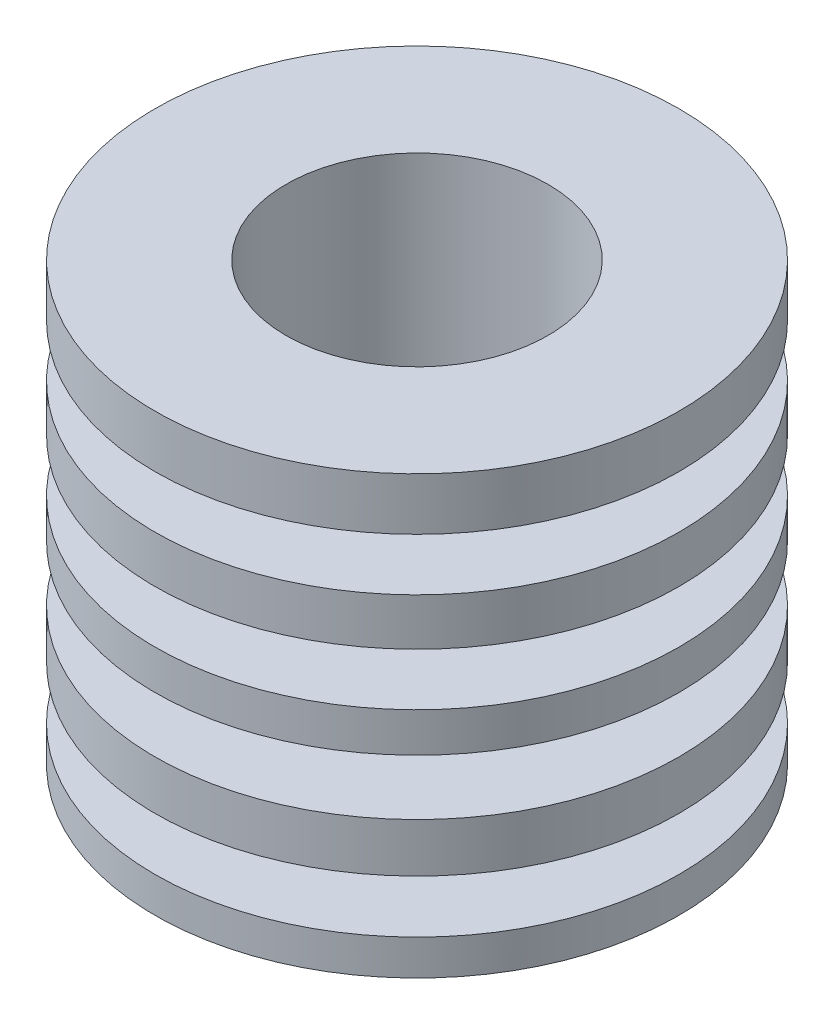
ISO-10303-21;
HEADER;
FILE_DESCRIPTION(('STEP AP214'),'2;1');
FILE_NAME('part.step','',(''),(''),'','','');
FILE_SCHEMA(('AUTOMOTIVE_DESIGN { 1 0 10303 214 1 1 1 1 }'));
ENDSEC;
DATA;
#1=APPLICATION_CONTEXT('core data for automotive mechanical design processes');
#2=APPLICATION_PROTOCOL_DEFINITION('international standard','automotive_design',2000,#1);
#3=PRODUCT_CONTEXT('',#1,'mechanical');
#4=PRODUCT('Part','Part','',(#3));
#5=PRODUCT_RELATED_PRODUCT_CATEGORY('part','',(#4));
#6=PRODUCT_DEFINITION_FORMATION('','',#4);
#7=PRODUCT_DEFINITION_CONTEXT('part definition',#1,'design');
#8=PRODUCT_DEFINITION('design','',#6,#7);
#9=PRODUCT_DEFINITION_SHAPE('','',#8);
#10=(LENGTH_UNIT() NAMED_UNIT(*) SI_UNIT(.MILLI.,.METRE.));
#11=(NAMED_UNIT(*) PLANE_ANGLE_UNIT() SI_UNIT($,.RADIAN.));
#12=(NAMED_UNIT(*) SI_UNIT($,.STERADIAN.) SOLID_ANGLE_UNIT());
#13=UNCERTAINTY_MEASURE_WITH_UNIT(LENGTH_MEASURE(1.E-05),#10,'distance_accuracy_value','');
#14=(GEOMETRIC_REPRESENTATION_CONTEXT(3) GLOBAL_UNCERTAINTY_ASSIGNED_CONTEXT((#13)) GLOBAL_UNIT_ASSIGNED_CONTEXT((#10,
#11,#12)) REPRESENTATION_CONTEXT('',''));
#15=CARTESIAN_POINT('',(0.,0.,0.));
#16=DIRECTION('',(0.,0.,1.));
#17=DIRECTION('',(1.,0.,0.));
#18=AXIS2_PLACEMENT_3D('',#15,#16,#17);
#19=CARTESIAN_POINT('',(0.,0.,0.));
#20=DIRECTION('',(0.,-1.,0.));
#21=DIRECTION('',(0.,0.,-1.));
#22=AXIS2_PLACEMENT_3D('',#19,#20,#21);
#23=CYLINDRICAL_SURFACE('',#22,150.);
#24=CARTESIAN_POINT('',(0.,190.,0.));
#25=DIRECTION('',(0.,-1.,0.));
#26=DIRECTION('',(1.,0.,0.));
#27=AXIS2_PLACEMENT_3D('',#24,#25,#26);
#28=CIRCLE('',#27,150.);
#29=CARTESIAN_POINT('',(150.,190.,0.));
#30=VERTEX_POINT('',#29);
#31=EDGE_CURVE('E50',#30,#30,#28,.T.);
#32=ORIENTED_EDGE('',*,*,#31,.T.);
#33=EDGE_LOOP('',(#32));
#34=FACE_BOUND('',#33,.T.);
#35=CARTESIAN_POINT('',(0.,163.026485548913,0.));
#36=DIRECTION('',(0.,-1.,0.));
#37=DIRECTION('',(1.,0.,0.));
#38=AXIS2_PLACEMENT_3D('',#35,#36,#37);
#39=CIRCLE('',#38,150.);
#40=CARTESIAN_POINT('',(150.,163.026485548913,0.));
#41=VERTEX_POINT('',#40);
#42=EDGE_CURVE('E79',#41,#41,#39,.T.);
#43=ORIENTED_EDGE('',*,*,#42,.F.);
#44=EDGE_LOOP('',(#43));
#45=FACE_BOUND('',#44,.T.);
#46=ADVANCED_FACE('F30',(#34,#45),#23,.T.);
#47=CARTESIAN_POINT('',(0.,0.,0.));
#48=DIRECTION('',(0.,-1.,0.));
#49=DIRECTION('',(0.,0.,-1.));
#50=AXIS2_PLACEMENT_3D('',#47,#48,#49);
#51=CIRCLE('',#50,150.);
#52=CARTESIAN_POINT('',(0.,0.,-150.));
#53=VERTEX_POINT('',#52);
#54=EDGE_CURVE('E41',#53,#53,#51,.T.);
#55=ORIENTED_EDGE('',*,*,#54,.F.);
#56=EDGE_LOOP('',(#55));
#57=FACE_BOUND('',#56,.T.);
#58=CARTESIAN_POINT('',(0.,20.2971054379458,0.));
#59=DIRECTION('',(0.,-1.,0.));
#60=DIRECTION('',(1.,0.,0.));
#61=AXIS2_PLACEMENT_3D('',#58,#59,#60);
#62=CIRCLE('',#61,150.);
#63=CARTESIAN_POINT('',(150.,20.2971054379458,0.));
#64=VERTEX_POINT('',#63);
#65=EDGE_CURVE('E63',#64,#64,#62,.T.);
#66=ORIENTED_EDGE('',*,*,#65,.T.);
#67=EDGE_LOOP('',(#66));
#68=FACE_BOUND('',#67,.T.);
#69=ADVANCED_FACE('F103',(#57,#68),#23,.T.);
#70=CARTESIAN_POINT('',(0.,250.,0.));
#71=DIRECTION('',(0.,-1.,0.));
#72=DIRECTION('',(0.,0.,-1.));
#73=AXIS2_PLACEMENT_3D('',#70,#71,#72);
#74=CIRCLE('',#73,150.);
#75=CARTESIAN_POINT('',(0.,250.,-150.));
#76=VERTEX_POINT('',#75);
#77=EDGE_CURVE('E37',#76,#76,#74,.T.);
#78=ORIENTED_EDGE('',*,*,#77,.T.);
#79=EDGE_LOOP('',(#78));
#80=FACE_BOUND('',#79,.T.);
#81=CARTESIAN_POINT('',(0.,220.,0.));
#82=DIRECTION('',(0.,-1.,0.));
#83=DIRECTION('',(1.,0.,0.));
#84=AXIS2_PLACEMENT_3D('',#81,#82,#83);
#85=CIRCLE('',#84,150.);
#86=CARTESIAN_POINT('',(150.,220.,0.));
#87=VERTEX_POINT('',#86);
#88=EDGE_CURVE('E59',#87,#87,#85,.T.);
#89=ORIENTED_EDGE('',*,*,#88,.F.);
#90=EDGE_LOOP('',(#89));
#91=FACE_BOUND('',#90,.T.);
#92=ADVANCED_FACE('F111',(#80,#91),#23,.T.);
#93=CARTESIAN_POINT('',(0.,0.,0.));
#94=DIRECTION('',(0.,-1.,0.));
#95=DIRECTION('',(0.,0.,-1.));
#96=AXIS2_PLACEMENT_3D('',#93,#94,#95);
#97=CYLINDRICAL_SURFACE('',#96,75.);
#98=CARTESIAN_POINT('',(0.,250.,0.));
#99=DIRECTION('',(0.,-1.,0.));
#100=DIRECTION('',(0.,0.,-1.));
#101=AXIS2_PLACEMENT_3D('',#98,#99,#100);
#102=CIRCLE('',#101,75.);
#103=CARTESIAN_POINT('',(0.,250.,-75.));
#104=VERTEX_POINT('',#103);
#105=EDGE_CURVE('E10',#104,#104,#102,.T.);
#106=ORIENTED_EDGE('',*,*,#105,.F.);
#107=EDGE_LOOP('',(#106));
#108=FACE_BOUND('',#107,.T.);
#109=CARTESIAN_POINT('',(0.,0.,0.));
#110=DIRECTION('',(0.,-1.,0.));
#111=DIRECTION('',(0.,0.,-1.));
#112=AXIS2_PLACEMENT_3D('',#109,#110,#111);
#113=CIRCLE('',#112,75.);
#114=CARTESIAN_POINT('',(0.,0.,-75.));
#115=VERTEX_POINT('',#114);
#116=EDGE_CURVE('E45',#115,#115,#113,.T.);
#117=ORIENTED_EDGE('',*,*,#116,.T.);
#118=EDGE_LOOP('',(#117));
#119=FACE_BOUND('',#118,.T.);
#120=ADVANCED_FACE('F32',(#108,#119),#97,.F.);
#121=CARTESIAN_POINT('',(-75.,250.,0.));
#122=DIRECTION('',(0.,-1.,0.));
#123=DIRECTION('',(0.,0.,-1.));
#124=AXIS2_PLACEMENT_3D('',#121,#122,#123);
#125=PLANE('',#124);
#126=ORIENTED_EDGE('',*,*,#77,.F.);
#127=EDGE_LOOP('',(#126));
#128=FACE_BOUND('',#127,.T.);
#129=ORIENTED_EDGE('',*,*,#105,.T.);
#130=EDGE_LOOP('',(#129));
#131=FACE_BOUND('',#130,.T.);
#132=ADVANCED_FACE('F131',(#128,#131),#125,.F.);
#133=CARTESIAN_POINT('',(-75.,0.,0.));
#134=DIRECTION('',(0.,1.,0.));
#135=DIRECTION('',(0.,0.,1.));
#136=AXIS2_PLACEMENT_3D('',#133,#134,#135);
#137=PLANE('',#136);
#138=ORIENTED_EDGE('',*,*,#116,.F.);
#139=EDGE_LOOP('',(#138));
#140=FACE_BOUND('',#139,.T.);
#141=ORIENTED_EDGE('',*,*,#54,.T.);
#142=EDGE_LOOP('',(#141));
#143=FACE_BOUND('',#142,.T.);
#144=ADVANCED_FACE('F152',(#140,#143),#137,.F.);
#145=CARTESIAN_POINT('',(-150.,190.,0.));
#146=DIRECTION('',(0.,1.,0.));
#147=DIRECTION('',(-1.,0.,0.));
#148=AXIS2_PLACEMENT_3D('',#145,#146,#147);
#149=PLANE('',#148);
#150=CARTESIAN_POINT('',(0.,190.,0.));
#151=DIRECTION('',(0.,-1.,0.));
#152=DIRECTION('',(1.,0.,0.));
#153=AXIS2_PLACEMENT_3D('',#150,#151,#152);
#154=CIRCLE('',#153,80.0301323284701);
#155=CARTESIAN_POINT('',(80.0301323284701,190.,0.));
#156=VERTEX_POINT('',#155);
#157=EDGE_CURVE('E53',#156,#156,#154,.T.);
#158=ORIENTED_EDGE('',*,*,#157,.T.);
#159=EDGE_LOOP('',(#158));
#160=FACE_BOUND('',#159,.T.);
#161=ORIENTED_EDGE('',*,*,#31,.F.);
#162=EDGE_LOOP('',(#161));
#163=FACE_BOUND('',#162,.T.);
#164=ADVANCED_FACE('F146',(#160,#163),#149,.T.);
#165=CARTESIAN_POINT('',(0.,0.,0.));
#166=DIRECTION('',(0.,-1.,0.));
#167=DIRECTION('',(1.,0.,0.));
#168=AXIS2_PLACEMENT_3D('',#165,#166,#167);
#169=CYLINDRICAL_SURFACE('',#168,80.0301323284701);
#170=CARTESIAN_POINT('',(0.,220.,0.));
#171=DIRECTION('',(0.,-1.,0.));
#172=DIRECTION('',(1.,0.,0.));
#173=AXIS2_PLACEMENT_3D('',#170,#171,#172);
#174=CIRCLE('',#173,80.0301323284701);
#175=CARTESIAN_POINT('',(80.03013232847,220.,0.));
#176=VERTEX_POINT('',#175);
#177=EDGE_CURVE('E56',#176,#176,#174,.T.);
#178=ORIENTED_EDGE('',*,*,#177,.T.);
#179=EDGE_LOOP('',(#178));
#180=FACE_BOUND('',#179,.T.);
#181=ORIENTED_EDGE('',*,*,#157,.F.);
#182=EDGE_LOOP('',(#181));
#183=FACE_BOUND('',#182,.T.);
#184=ADVANCED_FACE('F140',(#180,#183),#169,.T.);
#185=CARTESIAN_POINT('',(-150.,220.,0.));
#186=DIRECTION('',(0.,-1.,0.));
#187=DIRECTION('',(1.,0.,0.));
#188=AXIS2_PLACEMENT_3D('',#185,#186,#187);
#189=PLANE('',#188);
#190=ORIENTED_EDGE('',*,*,#88,.T.);
#191=EDGE_LOOP('',(#190));
#192=FACE_BOUND('',#191,.T.);
#193=ORIENTED_EDGE('',*,*,#177,.F.);
#194=EDGE_LOOP('',(#193));
#195=FACE_BOUND('',#194,.T.);
#196=ADVANCED_FACE('F136',(#192,#195),#189,.T.);
#197=CARTESIAN_POINT('',(-150.,20.2971054379457,0.));
#198=DIRECTION('',(0.,1.,0.));
#199=DIRECTION('',(-1.,0.,0.));
#200=AXIS2_PLACEMENT_3D('',#197,#198,#199);
#201=PLANE('',#200);
#202=CARTESIAN_POINT('',(0.,20.2971054379457,0.));
#203=DIRECTION('',(0.,-1.,0.));
#204=DIRECTION('',(1.,0.,0.));
#205=AXIS2_PLACEMENT_3D('',#202,#203,#204);
#206=CIRCLE('',#205,80.0301323284702);
#207=CARTESIAN_POINT('',(80.0301323284702,20.2971054379458,0.));
#208=VERTEX_POINT('',#207);
#209=EDGE_CURVE('E67',#208,#208,#206,.T.);
#210=ORIENTED_EDGE('',*,*,#209,.T.);
#211=EDGE_LOOP('',(#210));
#212=FACE_BOUND('',#211,.T.);
#213=ORIENTED_EDGE('',*,*,#65,.F.);
#214=EDGE_LOOP('',(#213));
#215=FACE_BOUND('',#214,.T.);
#216=ADVANCED_FACE('F139',(#212,#215),#201,.T.);
#217=CARTESIAN_POINT('',(0.,0.,0.));
#218=DIRECTION('',(0.,-1.,0.));
#219=DIRECTION('',(1.,0.,0.));
#220=AXIS2_PLACEMENT_3D('',#217,#218,#219);
#221=CYLINDRICAL_SURFACE('',#220,80.0301323284701);
#222=CARTESIAN_POINT('',(0.,50.5415732725955,0.));
#223=DIRECTION('',(0.,-1.,0.));
#224=DIRECTION('',(1.,0.,0.));
#225=AXIS2_PLACEMENT_3D('',#222,#223,#224);
#226=CIRCLE('',#225,80.0301323284701);
#227=CARTESIAN_POINT('',(80.0301323284701,50.5415732725955,0.));
#228=VERTEX_POINT('',#227);
#229=EDGE_CURVE('E70',#228,#228,#226,.T.);
#230=ORIENTED_EDGE('',*,*,#229,.T.);
#231=EDGE_LOOP('',(#230));
#232=FACE_BOUND('',#231,.T.);
#233=ORIENTED_EDGE('',*,*,#209,.F.);
#234=EDGE_LOOP('',(#233));
#235=FACE_BOUND('',#234,.T.);
#236=ADVANCED_FACE('F162',(#232,#235),#221,.T.);
#237=CARTESIAN_POINT('',(-150.,50.5415732725954,0.));
#238=DIRECTION('',(0.,-1.,0.));
#239=DIRECTION('',(1.,0.,0.));
#240=AXIS2_PLACEMENT_3D('',#237,#238,#239);
#241=PLANE('',#240);
#242=CARTESIAN_POINT('',(0.,50.5415732725955,0.));
#243=DIRECTION('',(0.,-1.,0.));
#244=DIRECTION('',(1.,0.,0.));
#245=AXIS2_PLACEMENT_3D('',#242,#243,#244);
#246=CIRCLE('',#245,150.);
#247=CARTESIAN_POINT('',(150.,50.5415732725955,0.));
#248=VERTEX_POINT('',#247);
#249=EDGE_CURVE('E73',#248,#248,#246,.T.);
#250=ORIENTED_EDGE('',*,*,#249,.T.);
#251=EDGE_LOOP('',(#250));
#252=FACE_BOUND('',#251,.T.);
#253=ORIENTED_EDGE('',*,*,#229,.F.);
#254=EDGE_LOOP('',(#253));
#255=FACE_BOUND('',#254,.T.);
#256=ADVANCED_FACE('F166',(#252,#255),#241,.T.);
#257=CARTESIAN_POINT('',(-150.,133.026485548913,0.));
#258=DIRECTION('',(0.,1.,0.));
#259=DIRECTION('',(-1.,0.,0.));
#260=AXIS2_PLACEMENT_3D('',#257,#258,#259);
#261=PLANE('',#260);
#262=CARTESIAN_POINT('',(0.,133.026485548913,0.));
#263=DIRECTION('',(0.,-1.,0.));
#264=DIRECTION('',(1.,0.,0.));
#265=AXIS2_PLACEMENT_3D('',#262,#263,#264);
#266=CIRCLE('',#265,80.0301323284701);
#267=CARTESIAN_POINT('',(80.0301323284701,133.026485548913,0.));
#268=VERTEX_POINT('',#267);
#269=EDGE_CURVE('E90',#268,#268,#266,.T.);
#270=ORIENTED_EDGE('',*,*,#269,.T.);
#271=EDGE_LOOP('',(#270));
#272=FACE_BOUND('',#271,.T.);
#273=CARTESIAN_POINT('',(0.,133.026485548913,0.));
#274=DIRECTION('',(0.,-1.,0.));
#275=DIRECTION('',(1.,0.,0.));
#276=AXIS2_PLACEMENT_3D('',#273,#274,#275);
#277=CIRCLE('',#276,150.);
#278=CARTESIAN_POINT('',(150.,133.026485548913,0.));
#279=VERTEX_POINT('',#278);
#280=EDGE_CURVE('E62',#279,#279,#277,.T.);
#281=ORIENTED_EDGE('',*,*,#280,.F.);
#282=EDGE_LOOP('',(#281));
#283=FACE_BOUND('',#282,.T.);
#284=ADVANCED_FACE('F169',(#272,#283),#261,.T.);
#285=CARTESIAN_POINT('',(0.,0.,0.));
#286=DIRECTION('',(0.,-1.,0.));
#287=DIRECTION('',(1.,0.,0.));
#288=AXIS2_PLACEMENT_3D('',#285,#286,#287);
#289=CYLINDRICAL_SURFACE('',#288,80.0301323284701);
#290=CARTESIAN_POINT('',(0.,163.026485548913,0.));
#291=DIRECTION('',(0.,-1.,0.));
#292=DIRECTION('',(1.,0.,0.));
#293=AXIS2_PLACEMENT_3D('',#290,#291,#292);
#294=CIRCLE('',#293,80.0301323284701);
#295=CARTESIAN_POINT('',(80.0301323284701,163.026485548913,0.));
#296=VERTEX_POINT('',#295);
#297=EDGE_CURVE('E93',#296,#296,#294,.T.);
#298=ORIENTED_EDGE('',*,*,#297,.T.);
#299=EDGE_LOOP('',(#298));
#300=FACE_BOUND('',#299,.T.);
#301=ORIENTED_EDGE('',*,*,#269,.F.);
#302=EDGE_LOOP('',(#301));
#303=FACE_BOUND('',#302,.T.);
#304=ADVANCED_FACE('F181',(#300,#303),#289,.T.);
#305=CARTESIAN_POINT('',(-150.,163.026485548913,0.));
#306=DIRECTION('',(0.,-1.,0.));
#307=DIRECTION('',(1.,0.,0.));
#308=AXIS2_PLACEMENT_3D('',#305,#306,#307);
#309=PLANE('',#308);
#310=ORIENTED_EDGE('',*,*,#42,.T.);
#311=EDGE_LOOP('',(#310));
#312=FACE_BOUND('',#311,.T.);
#313=ORIENTED_EDGE('',*,*,#297,.F.);
#314=EDGE_LOOP('',(#313));
#315=FACE_BOUND('',#314,.T.);
#316=ADVANCED_FACE('F99',(#312,#315),#309,.T.);
#317=ORIENTED_EDGE('',*,*,#249,.F.);
#318=EDGE_LOOP('',(#317));
#319=FACE_BOUND('',#318,.T.);
#320=CARTESIAN_POINT('',(0.,78.5864434465434,0.));
#321=DIRECTION('',(0.,-1.,0.));
#322=DIRECTION('',(1.,0.,0.));
#323=AXIS2_PLACEMENT_3D('',#320,#321,#322);
#324=CIRCLE('',#323,150.);
#325=CARTESIAN_POINT('',(150.,78.5864434465435,0.));
#326=VERTEX_POINT('',#325);
#327=EDGE_CURVE('E76',#326,#326,#324,.T.);
#328=ORIENTED_EDGE('',*,*,#327,.T.);
#329=EDGE_LOOP('',(#328));
#330=FACE_BOUND('',#329,.T.);
#331=ADVANCED_FACE('F106',(#319,#330),#23,.T.);
#332=CARTESIAN_POINT('',(0.,110.48060952672,0.));
#333=DIRECTION('',(0.,-1.,0.));
#334=DIRECTION('',(1.,0.,0.));
#335=AXIS2_PLACEMENT_3D('',#332,#333,#334);
#336=CIRCLE('',#335,150.);
#337=CARTESIAN_POINT('',(150.,110.48060952672,0.));
#338=VERTEX_POINT('',#337);
#339=EDGE_CURVE('E66',#338,#338,#336,.T.);
#340=ORIENTED_EDGE('',*,*,#339,.F.);
#341=EDGE_LOOP('',(#340));
#342=FACE_BOUND('',#341,.T.);
#343=ORIENTED_EDGE('',*,*,#280,.T.);
#344=EDGE_LOOP('',(#343));
#345=FACE_BOUND('',#344,.T.);
#346=ADVANCED_FACE('F107',(#342,#345),#23,.T.);
#347=CARTESIAN_POINT('',(-150.,78.5864434465434,0.));
#348=DIRECTION('',(0.,1.,0.));
#349=DIRECTION('',(-1.,0.,0.));
#350=AXIS2_PLACEMENT_3D('',#347,#348,#349);
#351=PLANE('',#350);
#352=CARTESIAN_POINT('',(0.,78.5864434465434,0.));
#353=DIRECTION('',(0.,-1.,0.));
#354=DIRECTION('',(1.,0.,0.));
#355=AXIS2_PLACEMENT_3D('',#352,#353,#354);
#356=CIRCLE('',#355,80.0301323284701);
#357=CARTESIAN_POINT('',(80.0301323284701,78.5864434465434,0.));
#358=VERTEX_POINT('',#357);
#359=EDGE_CURVE('E80',#358,#358,#356,.T.);
#360=ORIENTED_EDGE('',*,*,#359,.T.);
#361=EDGE_LOOP('',(#360));
#362=FACE_BOUND('',#361,.T.);
#363=ORIENTED_EDGE('',*,*,#327,.F.);
#364=EDGE_LOOP('',(#363));
#365=FACE_BOUND('',#364,.T.);
#366=ADVANCED_FACE('F117',(#362,#365),#351,.T.);
#367=CARTESIAN_POINT('',(0.,0.,0.));
#368=DIRECTION('',(0.,-1.,0.));
#369=DIRECTION('',(1.,0.,0.));
#370=AXIS2_PLACEMENT_3D('',#367,#368,#369);
#371=CYLINDRICAL_SURFACE('',#370,80.0301323284701);
#372=CARTESIAN_POINT('',(0.,110.48060952672,0.));
#373=DIRECTION('',(0.,-1.,0.));
#374=DIRECTION('',(1.,0.,0.));
#375=AXIS2_PLACEMENT_3D('',#372,#373,#374);
#376=CIRCLE('',#375,80.0301323284701);
#377=CARTESIAN_POINT('',(80.0301323284701,110.48060952672,0.));
#378=VERTEX_POINT('',#377);
#379=EDGE_CURVE('E83',#378,#378,#376,.T.);
#380=ORIENTED_EDGE('',*,*,#379,.T.);
#381=EDGE_LOOP('',(#380));
#382=FACE_BOUND('',#381,.T.);
#383=ORIENTED_EDGE('',*,*,#359,.F.);
#384=EDGE_LOOP('',(#383));
#385=FACE_BOUND('',#384,.T.);
#386=ADVANCED_FACE('F122',(#382,#385),#371,.T.);
#387=CARTESIAN_POINT('',(-150.,110.480609526719,0.));
#388=DIRECTION('',(0.,-1.,0.));
#389=DIRECTION('',(1.,0.,0.));
#390=AXIS2_PLACEMENT_3D('',#387,#388,#389);
#391=PLANE('',#390);
#392=ORIENTED_EDGE('',*,*,#339,.T.);
#393=EDGE_LOOP('',(#392));
#394=FACE_BOUND('',#393,.T.);
#395=ORIENTED_EDGE('',*,*,#379,.F.);
#396=EDGE_LOOP('',(#395));
#397=FACE_BOUND('',#396,.T.);
#398=ADVANCED_FACE('F174',(#394,#397),#391,.T.);
#399=CLOSED_SHELL('',(#46,#69,#92,#120,#132,#144,#164,#184,#196,#216,#236,#256,#284,#304,#316,
#331,#346,#366,#386,#398));
#400=MANIFOLD_SOLID_BREP('B2',#399);
#401=ADVANCED_BREP_SHAPE_REPRESENTATION('',(#18,#400),#14);
#402=SHAPE_DEFINITION_REPRESENTATION(#9,#401);
ENDSEC;
END-ISO-10303-21;
